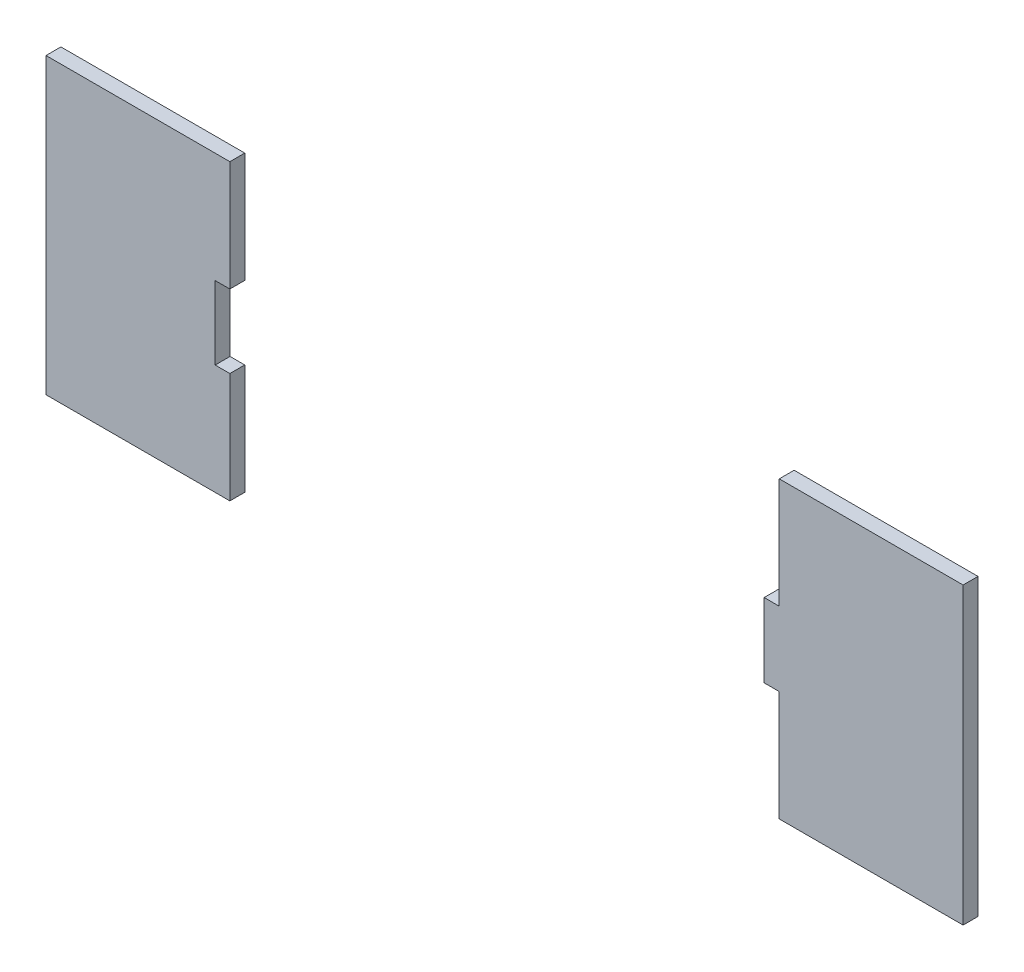
ISO-10303-21;
HEADER;
FILE_DESCRIPTION(('STEP AP214'),'2;1');
FILE_NAME('part.step','',(''),(''),'','','');
FILE_SCHEMA(('AUTOMOTIVE_DESIGN { 1 0 10303 214 1 1 1 1 }'));
ENDSEC;
DATA;
#1=APPLICATION_CONTEXT('core data for automotive mechanical design processes');
#2=APPLICATION_PROTOCOL_DEFINITION('international standard','automotive_design',2000,#1);
#3=PRODUCT_CONTEXT('',#1,'mechanical');
#4=PRODUCT('Part','Part','',(#3));
#5=PRODUCT_RELATED_PRODUCT_CATEGORY('part','',(#4));
#6=PRODUCT_DEFINITION_FORMATION('','',#4);
#7=PRODUCT_DEFINITION_CONTEXT('part definition',#1,'design');
#8=PRODUCT_DEFINITION('design','',#6,#7);
#9=PRODUCT_DEFINITION_SHAPE('','',#8);
#10=(LENGTH_UNIT() NAMED_UNIT(*) SI_UNIT(.MILLI.,.METRE.));
#11=(NAMED_UNIT(*) PLANE_ANGLE_UNIT() SI_UNIT($,.RADIAN.));
#12=(NAMED_UNIT(*) SI_UNIT($,.STERADIAN.) SOLID_ANGLE_UNIT());
#13=UNCERTAINTY_MEASURE_WITH_UNIT(LENGTH_MEASURE(1.E-05),#10,'distance_accuracy_value','');
#14=(GEOMETRIC_REPRESENTATION_CONTEXT(3) GLOBAL_UNCERTAINTY_ASSIGNED_CONTEXT((#13)) GLOBAL_UNIT_ASSIGNED_CONTEXT((#10,
#11,#12)) REPRESENTATION_CONTEXT('',''));
#15=CARTESIAN_POINT('',(0.,0.,0.));
#16=DIRECTION('',(0.,0.,1.));
#17=DIRECTION('',(1.,0.,0.));
#18=AXIS2_PLACEMENT_3D('',#15,#16,#17);
#19=CARTESIAN_POINT('',(147.724938622843,16.1783439490446,4.05));
#20=DIRECTION('',(1.,0.,0.));
#21=DIRECTION('',(0.,0.,-1.));
#22=AXIS2_PLACEMENT_3D('',#19,#20,#21);
#23=PLANE('',#22);
#24=DIRECTION('',(0.,-1.,0.));
#25=VECTOR('',#24,1.);
#26=CARTESIAN_POINT('',(147.724938622843,16.1783439490446,0.));
#27=LINE('',#26,#25);
#28=CARTESIAN_POINT('',(147.724938622843,16.1783439490446,0.));
#29=VERTEX_POINT('',#28);
#30=CARTESIAN_POINT('',(147.724938622843,-13.8216560509554,0.));
#31=VERTEX_POINT('',#30);
#32=EDGE_CURVE('E210',#29,#31,#27,.T.);
#33=ORIENTED_EDGE('',*,*,#32,.T.);
#34=DIRECTION('',(0.,0.,-1.));
#35=VECTOR('',#34,1.);
#36=CARTESIAN_POINT('',(147.724938622843,-13.8216560509554,4.05));
#37=LINE('',#36,#35);
#38=CARTESIAN_POINT('',(147.724938622843,-13.8216560509554,4.05));
#39=VERTEX_POINT('',#38);
#40=EDGE_CURVE('E13',#39,#31,#37,.T.);
#41=ORIENTED_EDGE('',*,*,#40,.F.);
#42=DIRECTION('',(0.,-1.,0.));
#43=VECTOR('',#42,1.);
#44=CARTESIAN_POINT('',(147.724938622843,16.1783439490446,4.05));
#45=LINE('',#44,#43);
#46=CARTESIAN_POINT('',(147.724938622843,16.1783439490446,4.05));
#47=VERTEX_POINT('',#46);
#48=EDGE_CURVE('E174',#47,#39,#45,.T.);
#49=ORIENTED_EDGE('',*,*,#48,.F.);
#50=DIRECTION('',(0.,0.,-1.));
#51=VECTOR('',#50,1.);
#52=CARTESIAN_POINT('',(147.724938622843,16.1783439490446,4.05));
#53=LINE('',#52,#51);
#54=EDGE_CURVE('E67',#47,#29,#53,.T.);
#55=ORIENTED_EDGE('',*,*,#54,.T.);
#56=EDGE_LOOP('',(#33,#41,#49,#55));
#57=FACE_BOUND('',#56,.T.);
#58=ADVANCED_FACE('F51',(#57),#23,.F.);
#59=CARTESIAN_POINT('',(147.724938622843,-13.8216560509554,4.05));
#60=DIRECTION('',(0.,-1.,0.));
#61=DIRECTION('',(1.,0.,0.));
#62=AXIS2_PLACEMENT_3D('',#59,#60,#61);
#63=PLANE('',#62);
#64=DIRECTION('',(-1.,0.,0.));
#65=VECTOR('',#64,1.);
#66=CARTESIAN_POINT('',(147.724938622843,-13.8216560509554,0.));
#67=LINE('',#66,#65);
#68=CARTESIAN_POINT('',(143.624938622843,-13.8216560509554,0.));
#69=VERTEX_POINT('',#68);
#70=EDGE_CURVE('E203',#31,#69,#67,.T.);
#71=ORIENTED_EDGE('',*,*,#70,.T.);
#72=DIRECTION('',(0.,0.,-1.));
#73=VECTOR('',#72,1.);
#74=CARTESIAN_POINT('',(143.624938622843,-13.8216560509554,4.05));
#75=LINE('',#74,#73);
#76=CARTESIAN_POINT('',(143.624938622843,-13.8216560509554,4.05));
#77=VERTEX_POINT('',#76);
#78=EDGE_CURVE('E59',#77,#69,#75,.T.);
#79=ORIENTED_EDGE('',*,*,#78,.F.);
#80=DIRECTION('',(-1.,0.,0.));
#81=VECTOR('',#80,1.);
#82=CARTESIAN_POINT('',(147.724938622843,-13.8216560509554,4.05));
#83=LINE('',#82,#81);
#84=EDGE_CURVE('E105',#39,#77,#83,.T.);
#85=ORIENTED_EDGE('',*,*,#84,.F.);
#86=ORIENTED_EDGE('',*,*,#40,.T.);
#87=EDGE_LOOP('',(#71,#79,#85,#86));
#88=FACE_BOUND('',#87,.T.);
#89=ADVANCED_FACE('F224',(#88),#63,.F.);
#90=CARTESIAN_POINT('',(143.624938622843,-13.8216560509554,4.05));
#91=DIRECTION('',(1.,0.,0.));
#92=DIRECTION('',(0.,0.,-1.));
#93=AXIS2_PLACEMENT_3D('',#90,#91,#92);
#94=PLANE('',#93);
#95=DIRECTION('',(0.,-1.,0.));
#96=VECTOR('',#95,1.);
#97=CARTESIAN_POINT('',(143.624938622843,-13.8216560509554,0.));
#98=LINE('',#97,#96);
#99=CARTESIAN_POINT('',(143.624938622843,-33.9216560509554,0.));
#100=VERTEX_POINT('',#99);
#101=EDGE_CURVE('E200',#69,#100,#98,.T.);
#102=ORIENTED_EDGE('',*,*,#101,.T.);
#103=DIRECTION('',(0.,0.,-1.));
#104=VECTOR('',#103,1.);
#105=CARTESIAN_POINT('',(143.624938622843,-33.9216560509554,4.05));
#106=LINE('',#105,#104);
#107=CARTESIAN_POINT('',(143.624938622843,-33.9216560509554,4.05));
#108=VERTEX_POINT('',#107);
#109=EDGE_CURVE('E192',#108,#100,#106,.T.);
#110=ORIENTED_EDGE('',*,*,#109,.F.);
#111=DIRECTION('',(0.,-1.,0.));
#112=VECTOR('',#111,1.);
#113=CARTESIAN_POINT('',(143.624938622843,-13.8216560509554,4.05));
#114=LINE('',#113,#112);
#115=EDGE_CURVE('E166',#77,#108,#114,.T.);
#116=ORIENTED_EDGE('',*,*,#115,.F.);
#117=ORIENTED_EDGE('',*,*,#78,.T.);
#118=EDGE_LOOP('',(#102,#110,#116,#117));
#119=FACE_BOUND('',#118,.T.);
#120=ADVANCED_FACE('F198',(#119),#94,.F.);
#121=CARTESIAN_POINT('',(147.724938622843,-33.9216560509554,4.05));
#122=DIRECTION('',(0.,-1.,0.));
#123=DIRECTION('',(0.,0.,-1.));
#124=AXIS2_PLACEMENT_3D('',#121,#122,#123);
#125=PLANE('',#124);
#126=DIRECTION('',(-1.,0.,0.));
#127=VECTOR('',#126,1.);
#128=CARTESIAN_POINT('',(147.724938622843,-33.9216560509554,0.));
#129=LINE('',#128,#127);
#130=CARTESIAN_POINT('',(147.724938622843,-33.9216560509554,0.));
#131=VERTEX_POINT('',#130);
#132=EDGE_CURVE('E206',#131,#100,#129,.T.);
#133=ORIENTED_EDGE('',*,*,#132,.F.);
#134=DIRECTION('',(0.,0.,-1.));
#135=VECTOR('',#134,1.);
#136=CARTESIAN_POINT('',(147.724938622843,-33.9216560509554,4.05));
#137=LINE('',#136,#135);
#138=CARTESIAN_POINT('',(147.724938622843,-33.9216560509554,4.05));
#139=VERTEX_POINT('',#138);
#140=EDGE_CURVE('E190',#139,#131,#137,.T.);
#141=ORIENTED_EDGE('',*,*,#140,.F.);
#142=DIRECTION('',(-1.,0.,0.));
#143=VECTOR('',#142,1.);
#144=CARTESIAN_POINT('',(147.724938622843,-33.9216560509554,4.05));
#145=LINE('',#144,#143);
#146=EDGE_CURVE('E161',#139,#108,#145,.T.);
#147=ORIENTED_EDGE('',*,*,#146,.T.);
#148=ORIENTED_EDGE('',*,*,#109,.T.);
#149=EDGE_LOOP('',(#133,#141,#147,#148));
#150=FACE_BOUND('',#149,.T.);
#151=ADVANCED_FACE('F216',(#150),#125,.T.);
#152=CARTESIAN_POINT('',(147.724938622843,-33.9216560509554,4.05));
#153=DIRECTION('',(1.,0.,0.));
#154=DIRECTION('',(0.,1.,0.));
#155=AXIS2_PLACEMENT_3D('',#152,#153,#154);
#156=PLANE('',#155);
#157=DIRECTION('',(0.,-1.,0.));
#158=VECTOR('',#157,1.);
#159=CARTESIAN_POINT('',(147.724938622843,-33.9216560509554,0.));
#160=LINE('',#159,#158);
#161=CARTESIAN_POINT('',(147.724938622843,-63.9216560509554,0.));
#162=VERTEX_POINT('',#161);
#163=EDGE_CURVE('E208',#131,#162,#160,.T.);
#164=ORIENTED_EDGE('',*,*,#163,.T.);
#165=DIRECTION('',(0.,0.,-1.));
#166=VECTOR('',#165,1.);
#167=CARTESIAN_POINT('',(147.724938622843,-63.9216560509554,4.05));
#168=LINE('',#167,#166);
#169=CARTESIAN_POINT('',(147.724938622843,-63.9216560509554,4.05));
#170=VERTEX_POINT('',#169);
#171=EDGE_CURVE('E142',#170,#162,#168,.T.);
#172=ORIENTED_EDGE('',*,*,#171,.F.);
#173=DIRECTION('',(0.,-1.,0.));
#174=VECTOR('',#173,1.);
#175=CARTESIAN_POINT('',(147.724938622843,-33.9216560509554,4.05));
#176=LINE('',#175,#174);
#177=EDGE_CURVE('E129',#139,#170,#176,.T.);
#178=ORIENTED_EDGE('',*,*,#177,.F.);
#179=ORIENTED_EDGE('',*,*,#140,.T.);
#180=EDGE_LOOP('',(#164,#172,#178,#179));
#181=FACE_BOUND('',#180,.T.);
#182=ADVANCED_FACE('F214',(#181),#156,.F.);
#183=CARTESIAN_POINT('',(147.724938622843,-63.9216560509554,4.05));
#184=DIRECTION('',(0.,1.,0.));
#185=DIRECTION('',(0.,0.,1.));
#186=AXIS2_PLACEMENT_3D('',#183,#184,#185);
#187=PLANE('',#186);
#188=DIRECTION('',(1.,0.,0.));
#189=VECTOR('',#188,1.);
#190=CARTESIAN_POINT('',(147.724938622843,-63.9216560509554,0.));
#191=LINE('',#190,#189);
#192=CARTESIAN_POINT('',(197.724938622843,-63.9216560509554,0.));
#193=VERTEX_POINT('',#192);
#194=EDGE_CURVE('E139',#162,#193,#191,.T.);
#195=ORIENTED_EDGE('',*,*,#194,.T.);
#196=DIRECTION('',(0.,0.,-1.));
#197=VECTOR('',#196,1.);
#198=CARTESIAN_POINT('',(197.724938622843,-63.9216560509554,4.05));
#199=LINE('',#198,#197);
#200=CARTESIAN_POINT('',(197.724938622843,-63.9216560509554,4.05));
#201=VERTEX_POINT('',#200);
#202=EDGE_CURVE('E136',#201,#193,#199,.T.);
#203=ORIENTED_EDGE('',*,*,#202,.F.);
#204=DIRECTION('',(1.,0.,0.));
#205=VECTOR('',#204,1.);
#206=CARTESIAN_POINT('',(147.724938622843,-63.9216560509554,4.05));
#207=LINE('',#206,#205);
#208=EDGE_CURVE('E121',#170,#201,#207,.T.);
#209=ORIENTED_EDGE('',*,*,#208,.F.);
#210=ORIENTED_EDGE('',*,*,#171,.T.);
#211=EDGE_LOOP('',(#195,#203,#209,#210));
#212=FACE_BOUND('',#211,.T.);
#213=ADVANCED_FACE('F137',(#212),#187,.F.);
#214=CARTESIAN_POINT('',(197.724938622843,16.1783439490446,4.05));
#215=DIRECTION('',(1.,0.,0.));
#216=DIRECTION('',(0.,0.,-1.));
#217=AXIS2_PLACEMENT_3D('',#214,#215,#216);
#218=PLANE('',#217);
#219=DIRECTION('',(0.,-1.,0.));
#220=VECTOR('',#219,1.);
#221=CARTESIAN_POINT('',(197.724938622843,16.1783439490446,0.));
#222=LINE('',#221,#220);
#223=CARTESIAN_POINT('',(197.724938622843,16.1783439490446,0.));
#224=VERTEX_POINT('',#223);
#225=EDGE_CURVE('E181',#224,#193,#222,.T.);
#226=ORIENTED_EDGE('',*,*,#225,.F.);
#227=DIRECTION('',(0.,0.,-1.));
#228=VECTOR('',#227,1.);
#229=CARTESIAN_POINT('',(197.724938622843,16.1783439490446,4.05));
#230=LINE('',#229,#228);
#231=CARTESIAN_POINT('',(197.724938622843,16.1783439490446,4.05));
#232=VERTEX_POINT('',#231);
#233=EDGE_CURVE('E93',#232,#224,#230,.T.);
#234=ORIENTED_EDGE('',*,*,#233,.F.);
#235=DIRECTION('',(0.,-1.,0.));
#236=VECTOR('',#235,1.);
#237=CARTESIAN_POINT('',(197.724938622843,16.1783439490446,4.05));
#238=LINE('',#237,#236);
#239=EDGE_CURVE('E126',#232,#201,#238,.T.);
#240=ORIENTED_EDGE('',*,*,#239,.T.);
#241=ORIENTED_EDGE('',*,*,#202,.T.);
#242=EDGE_LOOP('',(#226,#234,#240,#241));
#243=FACE_BOUND('',#242,.T.);
#244=ADVANCED_FACE('F144',(#243),#218,.T.);
#245=CARTESIAN_POINT('',(147.724938622843,16.1783439490446,4.05));
#246=DIRECTION('',(0.,1.,0.));
#247=DIRECTION('',(0.,0.,1.));
#248=AXIS2_PLACEMENT_3D('',#245,#246,#247);
#249=PLANE('',#248);
#250=DIRECTION('',(1.,0.,0.));
#251=VECTOR('',#250,1.);
#252=CARTESIAN_POINT('',(147.724938622843,16.1783439490446,0.));
#253=LINE('',#252,#251);
#254=EDGE_CURVE('E177',#29,#224,#253,.T.);
#255=ORIENTED_EDGE('',*,*,#254,.F.);
#256=ORIENTED_EDGE('',*,*,#54,.F.);
#257=DIRECTION('',(1.,0.,0.));
#258=VECTOR('',#257,1.);
#259=CARTESIAN_POINT('',(147.724938622843,16.1783439490446,4.05));
#260=LINE('',#259,#258);
#261=EDGE_CURVE('E146',#47,#232,#260,.T.);
#262=ORIENTED_EDGE('',*,*,#261,.T.);
#263=ORIENTED_EDGE('',*,*,#233,.T.);
#264=EDGE_LOOP('',(#255,#256,#262,#263));
#265=FACE_BOUND('',#264,.T.);
#266=ADVANCED_FACE('F230',(#265),#249,.T.);
#267=CARTESIAN_POINT('',(0.,0.,4.05));
#268=DIRECTION('',(0.,0.,-1.));
#269=DIRECTION('',(-1.,0.,0.));
#270=AXIS2_PLACEMENT_3D('',#267,#268,#269);
#271=PLANE('',#270);
#272=ORIENTED_EDGE('',*,*,#48,.T.);
#273=ORIENTED_EDGE('',*,*,#84,.T.);
#274=ORIENTED_EDGE('',*,*,#115,.T.);
#275=ORIENTED_EDGE('',*,*,#146,.F.);
#276=ORIENTED_EDGE('',*,*,#177,.T.);
#277=ORIENTED_EDGE('',*,*,#208,.T.);
#278=ORIENTED_EDGE('',*,*,#239,.F.);
#279=ORIENTED_EDGE('',*,*,#261,.F.);
#280=EDGE_LOOP('',(#272,#273,#274,#275,#276,#277,#278,#279));
#281=FACE_BOUND('',#280,.T.);
#282=ADVANCED_FACE('F123',(#281),#271,.F.);
#283=CARTESIAN_POINT('',(0.,0.,0.));
#284=DIRECTION('',(0.,0.,-1.));
#285=DIRECTION('',(-1.,0.,0.));
#286=AXIS2_PLACEMENT_3D('',#283,#284,#285);
#287=PLANE('',#286);
#288=ORIENTED_EDGE('',*,*,#32,.F.);
#289=ORIENTED_EDGE('',*,*,#254,.T.);
#290=ORIENTED_EDGE('',*,*,#225,.T.);
#291=ORIENTED_EDGE('',*,*,#194,.F.);
#292=ORIENTED_EDGE('',*,*,#163,.F.);
#293=ORIENTED_EDGE('',*,*,#132,.T.);
#294=ORIENTED_EDGE('',*,*,#101,.F.);
#295=ORIENTED_EDGE('',*,*,#70,.F.);
#296=EDGE_LOOP('',(#288,#289,#290,#291,#292,#293,#294,#295));
#297=FACE_BOUND('',#296,.T.);
#298=ADVANCED_FACE('F202',(#297),#287,.T.);
#299=CLOSED_SHELL('',(#58,#89,#120,#151,#182,#213,#244,#266,#282,#298));
#300=MANIFOLD_SOLID_BREP('B2',#299);
#301=CARTESIAN_POINT('',(-51.6732771179142,16.1783439490446,4.05));
#302=DIRECTION('',(1.,0.,0.));
#303=DIRECTION('',(0.,1.,0.));
#304=AXIS2_PLACEMENT_3D('',#301,#302,#303);
#305=PLANE('',#304);
#306=DIRECTION('',(0.,-1.,0.));
#307=VECTOR('',#306,1.);
#308=CARTESIAN_POINT('',(-51.6732771179142,16.1783439490446,0.));
#309=LINE('',#308,#307);
#310=CARTESIAN_POINT('',(-51.6732771179142,16.1783439490446,0.));
#311=VERTEX_POINT('',#310);
#312=CARTESIAN_POINT('',(-51.6732771179142,-63.7216560509554,0.));
#313=VERTEX_POINT('',#312);
#314=EDGE_CURVE('E451',#311,#313,#309,.T.);
#315=ORIENTED_EDGE('',*,*,#314,.T.);
#316=DIRECTION('',(0.,0.,-1.));
#317=VECTOR('',#316,1.);
#318=CARTESIAN_POINT('',(-51.6732771179142,-63.7216560509554,4.05));
#319=LINE('',#318,#317);
#320=CARTESIAN_POINT('',(-51.6732771179142,-63.7216560509554,4.05));
#321=VERTEX_POINT('',#320);
#322=EDGE_CURVE('E49',#321,#313,#319,.T.);
#323=ORIENTED_EDGE('',*,*,#322,.F.);
#324=DIRECTION('',(0.,-1.,0.));
#325=VECTOR('',#324,1.);
#326=CARTESIAN_POINT('',(-51.6732771179142,16.1783439490446,4.05));
#327=LINE('',#326,#325);
#328=CARTESIAN_POINT('',(-51.6732771179142,16.1783439490446,4.05));
#329=VERTEX_POINT('',#328);
#330=EDGE_CURVE('E423',#329,#321,#327,.T.);
#331=ORIENTED_EDGE('',*,*,#330,.F.);
#332=DIRECTION('',(0.,0.,-1.));
#333=VECTOR('',#332,1.);
#334=CARTESIAN_POINT('',(-51.6732771179142,16.1783439490446,4.05));
#335=LINE('',#334,#333);
#336=EDGE_CURVE('E318',#329,#311,#335,.T.);
#337=ORIENTED_EDGE('',*,*,#336,.T.);
#338=EDGE_LOOP('',(#315,#323,#331,#337));
#339=FACE_BOUND('',#338,.T.);
#340=ADVANCED_FACE('F302',(#339),#305,.F.);
#341=CARTESIAN_POINT('',(-51.6732771179142,-63.7216560509554,4.05));
#342=DIRECTION('',(0.,1.,0.));
#343=DIRECTION('',(0.,0.,1.));
#344=AXIS2_PLACEMENT_3D('',#341,#342,#343);
#345=PLANE('',#344);
#346=DIRECTION('',(1.,0.,0.));
#347=VECTOR('',#346,1.);
#348=CARTESIAN_POINT('',(-51.6732771179142,-63.7216560509554,0.));
#349=LINE('',#348,#347);
#350=CARTESIAN_POINT('',(-1.67327711791415,-63.7216560509554,0.));
#351=VERTEX_POINT('',#350);
#352=EDGE_CURVE('E449',#313,#351,#349,.T.);
#353=ORIENTED_EDGE('',*,*,#352,.T.);
#354=DIRECTION('',(0.,0.,-1.));
#355=VECTOR('',#354,1.);
#356=CARTESIAN_POINT('',(-1.67327711791415,-63.7216560509554,4.05));
#357=LINE('',#356,#355);
#358=CARTESIAN_POINT('',(-1.67327711791415,-63.7216560509554,4.05));
#359=VERTEX_POINT('',#358);
#360=EDGE_CURVE('E310',#359,#351,#357,.T.);
#361=ORIENTED_EDGE('',*,*,#360,.F.);
#362=DIRECTION('',(1.,0.,0.));
#363=VECTOR('',#362,1.);
#364=CARTESIAN_POINT('',(-51.6732771179142,-63.7216560509554,4.05));
#365=LINE('',#364,#363);
#366=EDGE_CURVE('E356',#321,#359,#365,.T.);
#367=ORIENTED_EDGE('',*,*,#366,.F.);
#368=ORIENTED_EDGE('',*,*,#322,.T.);
#369=EDGE_LOOP('',(#353,#361,#367,#368));
#370=FACE_BOUND('',#369,.T.);
#371=ADVANCED_FACE('F450',(#370),#345,.F.);
#372=CARTESIAN_POINT('',(-1.67327711791415,-33.7216560509554,4.05));
#373=DIRECTION('',(1.,0.,0.));
#374=DIRECTION('',(0.,1.,0.));
#375=AXIS2_PLACEMENT_3D('',#372,#373,#374);
#376=PLANE('',#375);
#377=DIRECTION('',(0.,-1.,0.));
#378=VECTOR('',#377,1.);
#379=CARTESIAN_POINT('',(-1.67327711791415,-33.7216560509554,0.));
#380=LINE('',#379,#378);
#381=CARTESIAN_POINT('',(-1.67327711791415,-33.7216560509554,0.));
#382=VERTEX_POINT('',#381);
#383=EDGE_CURVE('E447',#382,#351,#380,.T.);
#384=ORIENTED_EDGE('',*,*,#383,.F.);
#385=DIRECTION('',(0.,0.,-1.));
#386=VECTOR('',#385,1.);
#387=CARTESIAN_POINT('',(-1.67327711791415,-33.7216560509554,4.05));
#388=LINE('',#387,#386);
#389=CARTESIAN_POINT('',(-1.67327711791415,-33.7216560509554,4.05));
#390=VERTEX_POINT('',#389);
#391=EDGE_CURVE('E441',#390,#382,#388,.T.);
#392=ORIENTED_EDGE('',*,*,#391,.F.);
#393=DIRECTION('',(0.,-1.,0.));
#394=VECTOR('',#393,1.);
#395=CARTESIAN_POINT('',(-1.67327711791415,-33.7216560509554,4.05));
#396=LINE('',#395,#394);
#397=EDGE_CURVE('E414',#390,#359,#396,.T.);
#398=ORIENTED_EDGE('',*,*,#397,.T.);
#399=ORIENTED_EDGE('',*,*,#360,.T.);
#400=EDGE_LOOP('',(#384,#392,#398,#399));
#401=FACE_BOUND('',#400,.T.);
#402=ADVANCED_FACE('F445',(#401),#376,.T.);
#403=CARTESIAN_POINT('',(-1.67327711791415,-33.7216560509554,4.05));
#404=DIRECTION('',(0.,-1.,0.));
#405=DIRECTION('',(0.,0.,-1.));
#406=AXIS2_PLACEMENT_3D('',#403,#404,#405);
#407=PLANE('',#406);
#408=DIRECTION('',(-1.,0.,0.));
#409=VECTOR('',#408,1.);
#410=CARTESIAN_POINT('',(-1.67327711791415,-33.7216560509554,0.));
#411=LINE('',#410,#409);
#412=CARTESIAN_POINT('',(-5.67327711791415,-33.7216560509554,0.));
#413=VERTEX_POINT('',#412);
#414=EDGE_CURVE('E457',#382,#413,#411,.T.);
#415=ORIENTED_EDGE('',*,*,#414,.T.);
#416=DIRECTION('',(0.,0.,-1.));
#417=VECTOR('',#416,1.);
#418=CARTESIAN_POINT('',(-5.67327711791415,-33.7216560509554,4.05));
#419=LINE('',#418,#417);
#420=CARTESIAN_POINT('',(-5.67327711791415,-33.7216560509554,4.05));
#421=VERTEX_POINT('',#420);
#422=EDGE_CURVE('E439',#421,#413,#419,.T.);
#423=ORIENTED_EDGE('',*,*,#422,.F.);
#424=DIRECTION('',(-1.,0.,0.));
#425=VECTOR('',#424,1.);
#426=CARTESIAN_POINT('',(-1.67327711791415,-33.7216560509554,4.05));
#427=LINE('',#426,#425);
#428=EDGE_CURVE('E410',#390,#421,#427,.T.);
#429=ORIENTED_EDGE('',*,*,#428,.F.);
#430=ORIENTED_EDGE('',*,*,#391,.T.);
#431=EDGE_LOOP('',(#415,#423,#429,#430));
#432=FACE_BOUND('',#431,.T.);
#433=ADVANCED_FACE('F468',(#432),#407,.F.);
#434=CARTESIAN_POINT('',(-5.67327711791415,-13.8216560509554,4.05));
#435=DIRECTION('',(1.,0.,0.));
#436=DIRECTION('',(0.,1.,0.));
#437=AXIS2_PLACEMENT_3D('',#434,#435,#436);
#438=PLANE('',#437);
#439=DIRECTION('',(0.,-1.,0.));
#440=VECTOR('',#439,1.);
#441=CARTESIAN_POINT('',(-5.67327711791415,-13.8216560509554,0.));
#442=LINE('',#441,#440);
#443=CARTESIAN_POINT('',(-5.67327711791415,-13.8216560509554,0.));
#444=VERTEX_POINT('',#443);
#445=EDGE_CURVE('E459',#444,#413,#442,.T.);
#446=ORIENTED_EDGE('',*,*,#445,.F.);
#447=DIRECTION('',(0.,0.,-1.));
#448=VECTOR('',#447,1.);
#449=CARTESIAN_POINT('',(-5.67327711791415,-13.8216560509554,4.05));
#450=LINE('',#449,#448);
#451=CARTESIAN_POINT('',(-5.67327711791415,-13.8216560509554,4.05));
#452=VERTEX_POINT('',#451);
#453=EDGE_CURVE('E381',#452,#444,#450,.T.);
#454=ORIENTED_EDGE('',*,*,#453,.F.);
#455=DIRECTION('',(0.,-1.,0.));
#456=VECTOR('',#455,1.);
#457=CARTESIAN_POINT('',(-5.67327711791415,-13.8216560509554,4.05));
#458=LINE('',#457,#456);
#459=EDGE_CURVE('E390',#452,#421,#458,.T.);
#460=ORIENTED_EDGE('',*,*,#459,.T.);
#461=ORIENTED_EDGE('',*,*,#422,.T.);
#462=EDGE_LOOP('',(#446,#454,#460,#461));
#463=FACE_BOUND('',#462,.T.);
#464=ADVANCED_FACE('F464',(#463),#438,.T.);
#465=CARTESIAN_POINT('',(-1.67327711791415,-13.8216560509554,4.05));
#466=DIRECTION('',(0.,-1.,0.));
#467=DIRECTION('',(0.,0.,-1.));
#468=AXIS2_PLACEMENT_3D('',#465,#466,#467);
#469=PLANE('',#468);
#470=DIRECTION('',(-1.,0.,0.));
#471=VECTOR('',#470,1.);
#472=CARTESIAN_POINT('',(-1.67327711791415,-13.8216560509554,0.));
#473=LINE('',#472,#471);
#474=CARTESIAN_POINT('',(-1.67327711791415,-13.8216560509554,0.));
#475=VERTEX_POINT('',#474);
#476=EDGE_CURVE('E377',#475,#444,#473,.T.);
#477=ORIENTED_EDGE('',*,*,#476,.F.);
#478=DIRECTION('',(0.,0.,-1.));
#479=VECTOR('',#478,1.);
#480=CARTESIAN_POINT('',(-1.67327711791415,-13.8216560509554,4.05));
#481=LINE('',#480,#479);
#482=CARTESIAN_POINT('',(-1.67327711791415,-13.8216560509554,4.05));
#483=VERTEX_POINT('',#482);
#484=EDGE_CURVE('E372',#483,#475,#481,.T.);
#485=ORIENTED_EDGE('',*,*,#484,.F.);
#486=DIRECTION('',(-1.,0.,0.));
#487=VECTOR('',#486,1.);
#488=CARTESIAN_POINT('',(-1.67327711791415,-13.8216560509554,4.05));
#489=LINE('',#488,#487);
#490=EDGE_CURVE('E375',#483,#452,#489,.T.);
#491=ORIENTED_EDGE('',*,*,#490,.T.);
#492=ORIENTED_EDGE('',*,*,#453,.T.);
#493=EDGE_LOOP('',(#477,#485,#491,#492));
#494=FACE_BOUND('',#493,.T.);
#495=ADVANCED_FACE('F374',(#494),#469,.T.);
#496=CARTESIAN_POINT('',(-1.67327711791416,16.1783439490446,4.05));
#497=DIRECTION('',(1.,0.,0.));
#498=DIRECTION('',(0.,1.,0.));
#499=AXIS2_PLACEMENT_3D('',#496,#497,#498);
#500=PLANE('',#499);
#501=DIRECTION('',(0.,-1.,0.));
#502=VECTOR('',#501,1.);
#503=CARTESIAN_POINT('',(-1.67327711791416,16.1783439490446,0.));
#504=LINE('',#503,#502);
#505=CARTESIAN_POINT('',(-1.67327711791416,16.1783439490446,0.));
#506=VERTEX_POINT('',#505);
#507=EDGE_CURVE('E430',#506,#475,#504,.T.);
#508=ORIENTED_EDGE('',*,*,#507,.F.);
#509=DIRECTION('',(0.,0.,-1.));
#510=VECTOR('',#509,1.);
#511=CARTESIAN_POINT('',(-1.67327711791416,16.1783439490446,4.05));
#512=LINE('',#511,#510);
#513=CARTESIAN_POINT('',(-1.67327711791416,16.1783439490446,4.05));
#514=VERTEX_POINT('',#513);
#515=EDGE_CURVE('E344',#514,#506,#512,.T.);
#516=ORIENTED_EDGE('',*,*,#515,.F.);
#517=DIRECTION('',(0.,-1.,0.));
#518=VECTOR('',#517,1.);
#519=CARTESIAN_POINT('',(-1.67327711791416,16.1783439490446,4.05));
#520=LINE('',#519,#518);
#521=EDGE_CURVE('E388',#514,#483,#520,.T.);
#522=ORIENTED_EDGE('',*,*,#521,.T.);
#523=ORIENTED_EDGE('',*,*,#484,.T.);
#524=EDGE_LOOP('',(#508,#516,#522,#523));
#525=FACE_BOUND('',#524,.T.);
#526=ADVANCED_FACE('F393',(#525),#500,.T.);
#527=CARTESIAN_POINT('',(-51.6732771179142,16.1783439490446,4.05));
#528=DIRECTION('',(0.,1.,0.));
#529=DIRECTION('',(0.,0.,1.));
#530=AXIS2_PLACEMENT_3D('',#527,#528,#529);
#531=PLANE('',#530);
#532=DIRECTION('',(1.,0.,0.));
#533=VECTOR('',#532,1.);
#534=CARTESIAN_POINT('',(-51.6732771179142,16.1783439490446,0.));
#535=LINE('',#534,#533);
#536=EDGE_CURVE('E426',#311,#506,#535,.T.);
#537=ORIENTED_EDGE('',*,*,#536,.F.);
#538=ORIENTED_EDGE('',*,*,#336,.F.);
#539=DIRECTION('',(1.,0.,0.));
#540=VECTOR('',#539,1.);
#541=CARTESIAN_POINT('',(-51.6732771179142,16.1783439490446,4.05));
#542=LINE('',#541,#540);
#543=EDGE_CURVE('E395',#329,#514,#542,.T.);
#544=ORIENTED_EDGE('',*,*,#543,.T.);
#545=ORIENTED_EDGE('',*,*,#515,.T.);
#546=EDGE_LOOP('',(#537,#538,#544,#545));
#547=FACE_BOUND('',#546,.T.);
#548=ADVANCED_FACE('F481',(#547),#531,.T.);
#549=CARTESIAN_POINT('',(0.,0.,4.05));
#550=DIRECTION('',(0.,0.,1.));
#551=DIRECTION('',(1.,0.,0.));
#552=AXIS2_PLACEMENT_3D('',#549,#550,#551);
#553=PLANE('',#552);
#554=ORIENTED_EDGE('',*,*,#330,.T.);
#555=ORIENTED_EDGE('',*,*,#366,.T.);
#556=ORIENTED_EDGE('',*,*,#397,.F.);
#557=ORIENTED_EDGE('',*,*,#428,.T.);
#558=ORIENTED_EDGE('',*,*,#459,.F.);
#559=ORIENTED_EDGE('',*,*,#490,.F.);
#560=ORIENTED_EDGE('',*,*,#521,.F.);
#561=ORIENTED_EDGE('',*,*,#543,.F.);
#562=EDGE_LOOP('',(#554,#555,#556,#557,#558,#559,#560,#561));
#563=FACE_BOUND('',#562,.T.);
#564=ADVANCED_FACE('F386',(#563),#553,.T.);
#565=CARTESIAN_POINT('',(0.,0.,0.));
#566=DIRECTION('',(0.,0.,1.));
#567=DIRECTION('',(1.,0.,0.));
#568=AXIS2_PLACEMENT_3D('',#565,#566,#567);
#569=PLANE('',#568);
#570=ORIENTED_EDGE('',*,*,#314,.F.);
#571=ORIENTED_EDGE('',*,*,#536,.T.);
#572=ORIENTED_EDGE('',*,*,#507,.T.);
#573=ORIENTED_EDGE('',*,*,#476,.T.);
#574=ORIENTED_EDGE('',*,*,#445,.T.);
#575=ORIENTED_EDGE('',*,*,#414,.F.);
#576=ORIENTED_EDGE('',*,*,#383,.T.);
#577=ORIENTED_EDGE('',*,*,#352,.F.);
#578=EDGE_LOOP('',(#570,#571,#572,#573,#574,#575,#576,#577));
#579=FACE_BOUND('',#578,.T.);
#580=ADVANCED_FACE('F454',(#579),#569,.F.);
#581=CLOSED_SHELL('',(#340,#371,#402,#433,#464,#495,#526,#548,#564,#580));
#582=MANIFOLD_SOLID_BREP('B7',#581);
#583=ADVANCED_BREP_SHAPE_REPRESENTATION('',(#18,#300,#582),#14);
#584=SHAPE_DEFINITION_REPRESENTATION(#9,#583);
ENDSEC;
END-ISO-10303-21;
